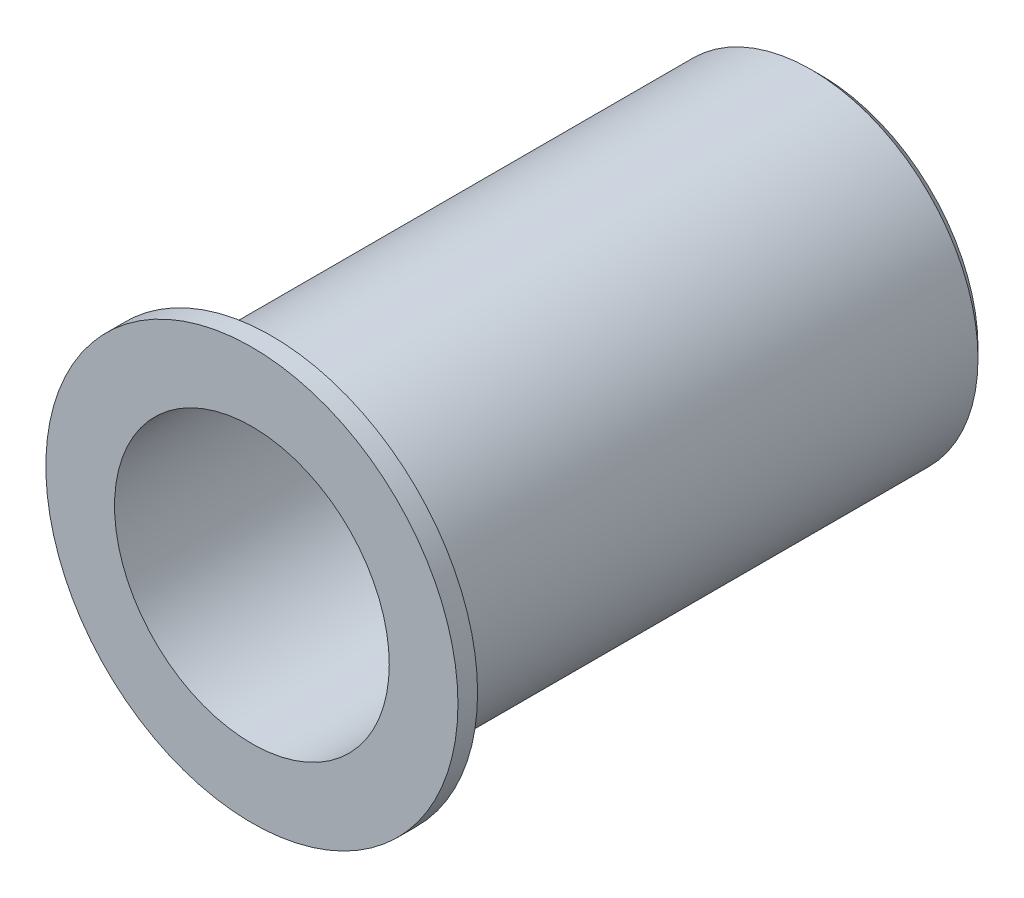
ISO-10303-21;
HEADER;
FILE_DESCRIPTION(('STEP AP214'),'2;1');
FILE_NAME('part.step','',(''),(''),'','','');
FILE_SCHEMA(('AUTOMOTIVE_DESIGN { 1 0 10303 214 1 1 1 1 }'));
ENDSEC;
DATA;
#1=APPLICATION_CONTEXT('core data for automotive mechanical design processes');
#2=APPLICATION_PROTOCOL_DEFINITION('international standard','automotive_design',2000,#1);
#3=PRODUCT_CONTEXT('',#1,'mechanical');
#4=PRODUCT('Part','Part','',(#3));
#5=PRODUCT_RELATED_PRODUCT_CATEGORY('part','',(#4));
#6=PRODUCT_DEFINITION_FORMATION('','',#4);
#7=PRODUCT_DEFINITION_CONTEXT('part definition',#1,'design');
#8=PRODUCT_DEFINITION('design','',#6,#7);
#9=PRODUCT_DEFINITION_SHAPE('','',#8);
#10=(LENGTH_UNIT() NAMED_UNIT(*) SI_UNIT(.MILLI.,.METRE.));
#11=(NAMED_UNIT(*) PLANE_ANGLE_UNIT() SI_UNIT($,.RADIAN.));
#12=(NAMED_UNIT(*) SI_UNIT($,.STERADIAN.) SOLID_ANGLE_UNIT());
#13=UNCERTAINTY_MEASURE_WITH_UNIT(LENGTH_MEASURE(1.E-05),#10,'distance_accuracy_value','');
#14=(GEOMETRIC_REPRESENTATION_CONTEXT(3) GLOBAL_UNCERTAINTY_ASSIGNED_CONTEXT((#13)) GLOBAL_UNIT_ASSIGNED_CONTEXT((#10,
#11,#12)) REPRESENTATION_CONTEXT('',''));
#15=CARTESIAN_POINT('',(0.,0.,0.));
#16=DIRECTION('',(0.,0.,1.));
#17=DIRECTION('',(1.,0.,0.));
#18=AXIS2_PLACEMENT_3D('',#15,#16,#17);
#19=CARTESIAN_POINT('',(0.,0.,28.));
#20=DIRECTION('',(0.,0.,-1.));
#21=DIRECTION('',(-1.,0.,0.));
#22=AXIS2_PLACEMENT_3D('',#19,#20,#21);
#23=CYLINDRICAL_SURFACE('',#22,8.5);
#24=CARTESIAN_POINT('',(0.,0.,0.499999999999997));
#25=DIRECTION('',(0.,0.,1.));
#26=DIRECTION('',(1.,0.,0.));
#27=AXIS2_PLACEMENT_3D('',#24,#25,#26);
#28=CIRCLE('',#27,8.5);
#29=CARTESIAN_POINT('',(8.5,0.,0.499999999999997));
#30=VERTEX_POINT('',#29);
#31=EDGE_CURVE('E51',#30,#30,#28,.T.);
#32=ORIENTED_EDGE('',*,*,#31,.T.);
#33=EDGE_LOOP('',(#32));
#34=FACE_BOUND('',#33,.T.);
#35=CARTESIAN_POINT('',(0.,0.,28.));
#36=DIRECTION('',(0.,0.,1.));
#37=DIRECTION('',(1.,0.,0.));
#38=AXIS2_PLACEMENT_3D('',#35,#36,#37);
#39=CIRCLE('',#38,8.5);
#40=CARTESIAN_POINT('',(8.5,0.,28.));
#41=VERTEX_POINT('',#40);
#42=EDGE_CURVE('E55',#41,#41,#39,.T.);
#43=ORIENTED_EDGE('',*,*,#42,.F.);
#44=EDGE_LOOP('',(#43));
#45=FACE_BOUND('',#44,.T.);
#46=ADVANCED_FACE('F43',(#34,#45),#23,.T.);
#47=CARTESIAN_POINT('',(0.,0.,0.));
#48=DIRECTION('',(0.,0.,1.));
#49=DIRECTION('',(1.,0.,0.));
#50=AXIS2_PLACEMENT_3D('',#47,#48,#49);
#51=PLANE('',#50);
#52=CARTESIAN_POINT('',(0.,0.,0.));
#53=DIRECTION('',(0.,0.,1.));
#54=DIRECTION('',(1.,0.,0.));
#55=AXIS2_PLACEMENT_3D('',#52,#53,#54);
#56=CIRCLE('',#55,8.);
#57=CARTESIAN_POINT('',(8.,0.,0.));
#58=VERTEX_POINT('',#57);
#59=EDGE_CURVE('E10',#58,#58,#56,.F.);
#60=ORIENTED_EDGE('',*,*,#59,.T.);
#61=EDGE_LOOP('',(#60));
#62=FACE_BOUND('',#61,.T.);
#63=CARTESIAN_POINT('',(0.,5.,0.));
#64=DIRECTION('',(0.,0.,-1.));
#65=DIRECTION('',(-1.,0.,0.));
#66=AXIS2_PLACEMENT_3D('',#63,#64,#65);
#67=CIRCLE('',#66,1.65);
#68=CARTESIAN_POINT('',(-1.65,5.,0.));
#69=VERTEX_POINT('',#68);
#70=EDGE_CURVE('E66',#69,#69,#67,.T.);
#71=ORIENTED_EDGE('',*,*,#70,.F.);
#72=EDGE_LOOP('',(#71));
#73=FACE_BOUND('',#72,.T.);
#74=CARTESIAN_POINT('',(0.,0.,0.));
#75=DIRECTION('',(0.,0.,-1.));
#76=DIRECTION('',(-1.,0.,0.));
#77=AXIS2_PLACEMENT_3D('',#74,#75,#76);
#78=CIRCLE('',#77,1.65);
#79=CARTESIAN_POINT('',(-1.65,0.,0.));
#80=VERTEX_POINT('',#79);
#81=EDGE_CURVE('E65',#80,#80,#78,.T.);
#82=ORIENTED_EDGE('',*,*,#81,.F.);
#83=EDGE_LOOP('',(#82));
#84=FACE_BOUND('',#83,.T.);
#85=CARTESIAN_POINT('',(4.33012701892166,-2.50000000000031,0.));
#86=DIRECTION('',(0.,0.,-1.));
#87=DIRECTION('',(-1.,0.,0.));
#88=AXIS2_PLACEMENT_3D('',#85,#86,#87);
#89=CIRCLE('',#88,1.65);
#90=CARTESIAN_POINT('',(2.68012701892166,-2.50000000000031,0.));
#91=VERTEX_POINT('',#90);
#92=EDGE_CURVE('E70',#91,#91,#89,.T.);
#93=ORIENTED_EDGE('',*,*,#92,.F.);
#94=EDGE_LOOP('',(#93));
#95=FACE_BOUND('',#94,.T.);
#96=CARTESIAN_POINT('',(-4.33012701892272,-2.49999999999969,0.));
#97=DIRECTION('',(0.,0.,-1.));
#98=DIRECTION('',(-1.,0.,0.));
#99=AXIS2_PLACEMENT_3D('',#96,#97,#98);
#100=CIRCLE('',#99,1.65);
#101=CARTESIAN_POINT('',(-5.98012701892272,-2.49999999999969,0.));
#102=VERTEX_POINT('',#101);
#103=EDGE_CURVE('E74',#102,#102,#100,.T.);
#104=ORIENTED_EDGE('',*,*,#103,.F.);
#105=EDGE_LOOP('',(#104));
#106=FACE_BOUND('',#105,.T.);
#107=ADVANCED_FACE('F119',(#62,#73,#84,#95,#106),#51,.F.);
#108=CARTESIAN_POINT('',(0.,0.,5.));
#109=DIRECTION('',(0.,0.,1.));
#110=DIRECTION('',(1.,0.,0.));
#111=AXIS2_PLACEMENT_3D('',#108,#109,#110);
#112=CYLINDRICAL_SURFACE('',#111,7.);
#113=CARTESIAN_POINT('',(0.,0.,5.));
#114=DIRECTION('',(0.,0.,1.));
#115=DIRECTION('',(1.,0.,0.));
#116=AXIS2_PLACEMENT_3D('',#113,#114,#115);
#117=CIRCLE('',#116,7.);
#118=CARTESIAN_POINT('',(7.,0.,5.));
#119=VERTEX_POINT('',#118);
#120=EDGE_CURVE('E59',#119,#119,#117,.T.);
#121=ORIENTED_EDGE('',*,*,#120,.F.);
#122=EDGE_LOOP('',(#121));
#123=FACE_BOUND('',#122,.T.);
#124=CARTESIAN_POINT('',(0.,0.,29.));
#125=DIRECTION('',(0.,0.,1.));
#126=DIRECTION('',(1.,0.,0.));
#127=AXIS2_PLACEMENT_3D('',#124,#125,#126);
#128=CIRCLE('',#127,7.);
#129=CARTESIAN_POINT('',(7.,0.,29.));
#130=VERTEX_POINT('',#129);
#131=EDGE_CURVE('E88',#130,#130,#128,.F.);
#132=ORIENTED_EDGE('',*,*,#131,.F.);
#133=EDGE_LOOP('',(#132));
#134=FACE_BOUND('',#133,.T.);
#135=ADVANCED_FACE('F123',(#123,#134),#112,.F.);
#136=CARTESIAN_POINT('',(0.,0.,5.));
#137=DIRECTION('',(0.,0.,1.));
#138=DIRECTION('',(1.,0.,0.));
#139=AXIS2_PLACEMENT_3D('',#136,#137,#138);
#140=PLANE('',#139);
#141=CARTESIAN_POINT('',(0.,5.,5.));
#142=DIRECTION('',(0.,0.,1.));
#143=DIRECTION('',(1.,0.,0.));
#144=AXIS2_PLACEMENT_3D('',#141,#142,#143);
#145=CIRCLE('',#144,1.65);
#146=CARTESIAN_POINT('',(1.65,5.,5.));
#147=VERTEX_POINT('',#146);
#148=EDGE_CURVE('E62',#147,#147,#145,.T.);
#149=ORIENTED_EDGE('',*,*,#148,.F.);
#150=EDGE_LOOP('',(#149));
#151=FACE_BOUND('',#150,.T.);
#152=CARTESIAN_POINT('',(0.,0.,5.));
#153=DIRECTION('',(0.,0.,1.));
#154=DIRECTION('',(1.,0.,0.));
#155=AXIS2_PLACEMENT_3D('',#152,#153,#154);
#156=CIRCLE('',#155,1.65);
#157=CARTESIAN_POINT('',(1.65,0.,5.));
#158=VERTEX_POINT('',#157);
#159=EDGE_CURVE('E67',#158,#158,#156,.T.);
#160=ORIENTED_EDGE('',*,*,#159,.F.);
#161=EDGE_LOOP('',(#160));
#162=FACE_BOUND('',#161,.T.);
#163=CARTESIAN_POINT('',(4.33012701892166,-2.50000000000031,5.));
#164=DIRECTION('',(0.,0.,1.));
#165=DIRECTION('',(1.,0.,0.));
#166=AXIS2_PLACEMENT_3D('',#163,#164,#165);
#167=CIRCLE('',#166,1.65);
#168=CARTESIAN_POINT('',(5.98012701892166,-2.50000000000031,5.));
#169=VERTEX_POINT('',#168);
#170=EDGE_CURVE('E71',#169,#169,#167,.T.);
#171=ORIENTED_EDGE('',*,*,#170,.F.);
#172=EDGE_LOOP('',(#171));
#173=FACE_BOUND('',#172,.T.);
#174=CARTESIAN_POINT('',(-4.33012701892272,-2.49999999999969,5.));
#175=DIRECTION('',(0.,0.,1.));
#176=DIRECTION('',(1.,0.,0.));
#177=AXIS2_PLACEMENT_3D('',#174,#175,#176);
#178=CIRCLE('',#177,1.65);
#179=CARTESIAN_POINT('',(-2.68012701892273,-2.49999999999969,5.));
#180=VERTEX_POINT('',#179);
#181=EDGE_CURVE('E75',#180,#180,#178,.T.);
#182=ORIENTED_EDGE('',*,*,#181,.F.);
#183=EDGE_LOOP('',(#182));
#184=FACE_BOUND('',#183,.T.);
#185=ORIENTED_EDGE('',*,*,#120,.T.);
#186=EDGE_LOOP('',(#185));
#187=FACE_BOUND('',#186,.T.);
#188=ADVANCED_FACE('F129',(#151,#162,#173,#184,#187),#140,.T.);
#189=CARTESIAN_POINT('',(-4.33012701892272,-2.49999999999969,0.));
#190=DIRECTION('',(0.,0.,-1.));
#191=DIRECTION('',(-1.,0.,0.));
#192=AXIS2_PLACEMENT_3D('',#189,#190,#191);
#193=CYLINDRICAL_SURFACE('',#192,1.65);
#194=ORIENTED_EDGE('',*,*,#181,.T.);
#195=EDGE_LOOP('',(#194));
#196=FACE_BOUND('',#195,.T.);
#197=ORIENTED_EDGE('',*,*,#103,.T.);
#198=EDGE_LOOP('',(#197));
#199=FACE_BOUND('',#198,.T.);
#200=ADVANCED_FACE('F133',(#196,#199),#193,.F.);
#201=CARTESIAN_POINT('',(4.33012701892166,-2.50000000000031,0.));
#202=DIRECTION('',(0.,0.,-1.));
#203=DIRECTION('',(-1.,0.,0.));
#204=AXIS2_PLACEMENT_3D('',#201,#202,#203);
#205=CYLINDRICAL_SURFACE('',#204,1.65);
#206=ORIENTED_EDGE('',*,*,#170,.T.);
#207=EDGE_LOOP('',(#206));
#208=FACE_BOUND('',#207,.T.);
#209=ORIENTED_EDGE('',*,*,#92,.T.);
#210=EDGE_LOOP('',(#209));
#211=FACE_BOUND('',#210,.T.);
#212=ADVANCED_FACE('F137',(#208,#211),#205,.F.);
#213=CARTESIAN_POINT('',(0.,0.,0.));
#214=DIRECTION('',(0.,0.,-1.));
#215=DIRECTION('',(-1.,0.,0.));
#216=AXIS2_PLACEMENT_3D('',#213,#214,#215);
#217=CYLINDRICAL_SURFACE('',#216,1.65);
#218=ORIENTED_EDGE('',*,*,#159,.T.);
#219=EDGE_LOOP('',(#218));
#220=FACE_BOUND('',#219,.T.);
#221=ORIENTED_EDGE('',*,*,#81,.T.);
#222=EDGE_LOOP('',(#221));
#223=FACE_BOUND('',#222,.T.);
#224=ADVANCED_FACE('F141',(#220,#223),#217,.F.);
#225=CARTESIAN_POINT('',(0.,5.,0.));
#226=DIRECTION('',(0.,0.,-1.));
#227=DIRECTION('',(-1.,0.,0.));
#228=AXIS2_PLACEMENT_3D('',#225,#226,#227);
#229=CYLINDRICAL_SURFACE('',#228,1.65);
#230=ORIENTED_EDGE('',*,*,#148,.T.);
#231=EDGE_LOOP('',(#230));
#232=FACE_BOUND('',#231,.T.);
#233=ORIENTED_EDGE('',*,*,#70,.T.);
#234=EDGE_LOOP('',(#233));
#235=FACE_BOUND('',#234,.T.);
#236=ADVANCED_FACE('F104',(#232,#235),#229,.F.);
#237=CARTESIAN_POINT('',(0.,0.,29.));
#238=DIRECTION('',(0.,0.,-1.));
#239=DIRECTION('',(-1.,0.,0.));
#240=AXIS2_PLACEMENT_3D('',#237,#238,#239);
#241=CYLINDRICAL_SURFACE('',#240,10.5);
#242=CARTESIAN_POINT('',(0.,0.,29.));
#243=DIRECTION('',(0.,0.,1.));
#244=DIRECTION('',(1.,0.,0.));
#245=AXIS2_PLACEMENT_3D('',#242,#243,#244);
#246=CIRCLE('',#245,10.5);
#247=CARTESIAN_POINT('',(10.5,0.,29.));
#248=VERTEX_POINT('',#247);
#249=EDGE_CURVE('E92',#248,#248,#246,.T.);
#250=ORIENTED_EDGE('',*,*,#249,.F.);
#251=EDGE_LOOP('',(#250));
#252=FACE_BOUND('',#251,.T.);
#253=CARTESIAN_POINT('',(0.,0.,28.));
#254=DIRECTION('',(0.,0.,1.));
#255=DIRECTION('',(1.,0.,0.));
#256=AXIS2_PLACEMENT_3D('',#253,#254,#255);
#257=CIRCLE('',#256,10.5);
#258=CARTESIAN_POINT('',(10.5,0.,28.));
#259=VERTEX_POINT('',#258);
#260=EDGE_CURVE('E89',#259,#259,#257,.T.);
#261=ORIENTED_EDGE('',*,*,#260,.T.);
#262=EDGE_LOOP('',(#261));
#263=FACE_BOUND('',#262,.T.);
#264=ADVANCED_FACE('F101',(#252,#263),#241,.T.);
#265=CARTESIAN_POINT('',(0.,0.,29.));
#266=DIRECTION('',(0.,0.,1.));
#267=DIRECTION('',(1.,0.,0.));
#268=AXIS2_PLACEMENT_3D('',#265,#266,#267);
#269=PLANE('',#268);
#270=ORIENTED_EDGE('',*,*,#249,.T.);
#271=EDGE_LOOP('',(#270));
#272=FACE_BOUND('',#271,.T.);
#273=ORIENTED_EDGE('',*,*,#131,.T.);
#274=EDGE_LOOP('',(#273));
#275=FACE_BOUND('',#274,.T.);
#276=ADVANCED_FACE('F98',(#272,#275),#269,.T.);
#277=CARTESIAN_POINT('',(0.,0.,28.));
#278=DIRECTION('',(0.,0.,1.));
#279=DIRECTION('',(1.,0.,0.));
#280=AXIS2_PLACEMENT_3D('',#277,#278,#279);
#281=PLANE('',#280);
#282=ORIENTED_EDGE('',*,*,#42,.T.);
#283=EDGE_LOOP('',(#282));
#284=FACE_BOUND('',#283,.T.);
#285=ORIENTED_EDGE('',*,*,#260,.F.);
#286=EDGE_LOOP('',(#285));
#287=FACE_BOUND('',#286,.T.);
#288=ADVANCED_FACE('F108',(#284,#287),#281,.F.);
#289=CARTESIAN_POINT('',(0.,0.,0.499999999999997));
#290=DIRECTION('',(0.,0.,1.));
#291=DIRECTION('',(1.,0.,0.));
#292=AXIS2_PLACEMENT_3D('',#289,#290,#291);
#293=CONICAL_SURFACE('',#292,8.5,0.785398163397452);
#294=ORIENTED_EDGE('',*,*,#59,.F.);
#295=EDGE_LOOP('',(#294));
#296=FACE_BOUND('',#295,.T.);
#297=ORIENTED_EDGE('',*,*,#31,.F.);
#298=EDGE_LOOP('',(#297));
#299=FACE_BOUND('',#298,.T.);
#300=ADVANCED_FACE('F46',(#296,#299),#293,.T.);
#301=CLOSED_SHELL('',(#46,#107,#135,#188,#200,#212,#224,#236,#264,#276,#288,#300));
#302=MANIFOLD_SOLID_BREP('B2',#301);
#303=ADVANCED_BREP_SHAPE_REPRESENTATION('',(#18,#302),#14);
#304=SHAPE_DEFINITION_REPRESENTATION(#9,#303);
ENDSEC;
END-ISO-10303-21;
